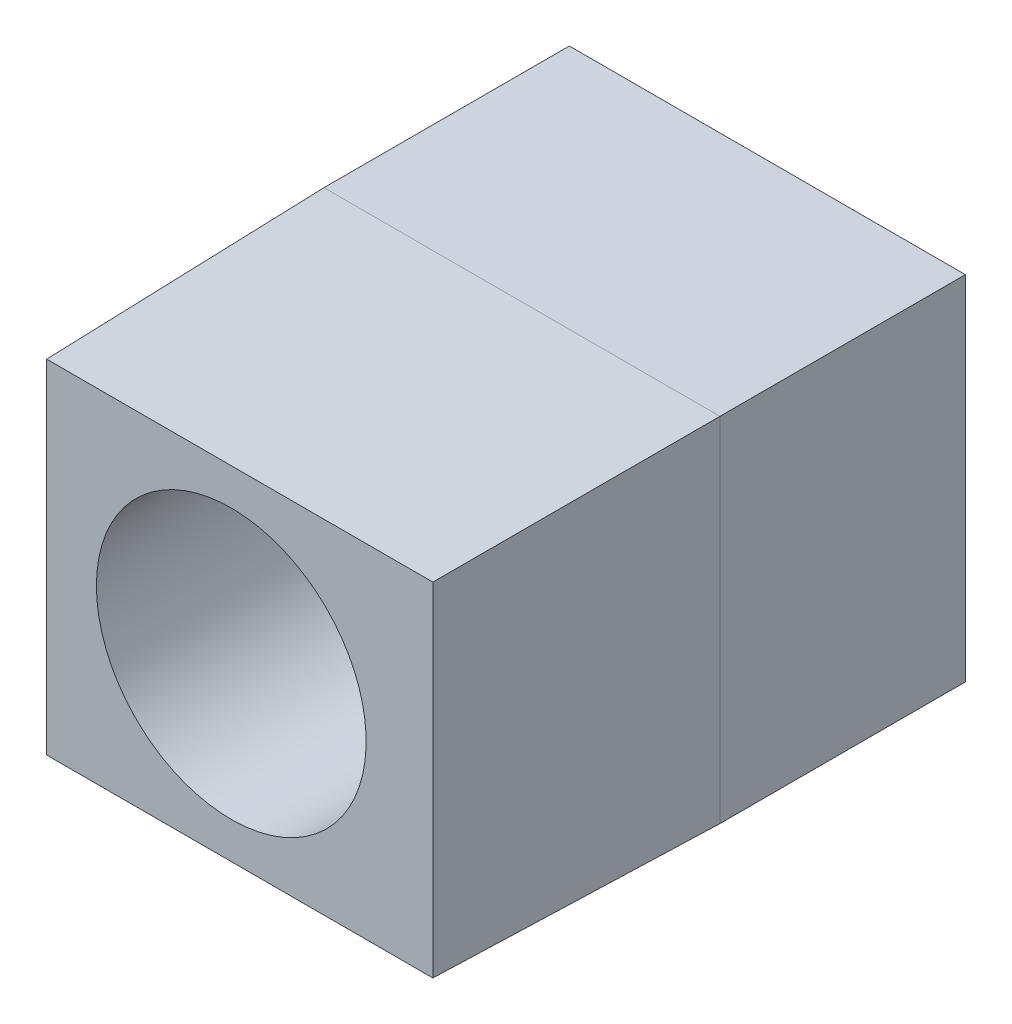
ISO-10303-21;
HEADER;
FILE_DESCRIPTION(('STEP AP214'),'2;1');
FILE_NAME('part.step','',(''),(''),'','','');
FILE_SCHEMA(('AUTOMOTIVE_DESIGN { 1 0 10303 214 1 1 1 1 }'));
ENDSEC;
DATA;
#1=APPLICATION_CONTEXT('core data for automotive mechanical design processes');
#2=APPLICATION_PROTOCOL_DEFINITION('international standard','automotive_design',2000,#1);
#3=PRODUCT_CONTEXT('',#1,'mechanical');
#4=PRODUCT('Part','Part','',(#3));
#5=PRODUCT_RELATED_PRODUCT_CATEGORY('part','',(#4));
#6=PRODUCT_DEFINITION_FORMATION('','',#4);
#7=PRODUCT_DEFINITION_CONTEXT('part definition',#1,'design');
#8=PRODUCT_DEFINITION('design','',#6,#7);
#9=PRODUCT_DEFINITION_SHAPE('','',#8);
#10=(LENGTH_UNIT() NAMED_UNIT(*) SI_UNIT(.MILLI.,.METRE.));
#11=(NAMED_UNIT(*) PLANE_ANGLE_UNIT() SI_UNIT($,.RADIAN.));
#12=(NAMED_UNIT(*) SI_UNIT($,.STERADIAN.) SOLID_ANGLE_UNIT());
#13=UNCERTAINTY_MEASURE_WITH_UNIT(LENGTH_MEASURE(1.E-05),#10,'distance_accuracy_value','');
#14=(GEOMETRIC_REPRESENTATION_CONTEXT(3) GLOBAL_UNCERTAINTY_ASSIGNED_CONTEXT((#13)) GLOBAL_UNIT_ASSIGNED_CONTEXT((#10,
#11,#12)) REPRESENTATION_CONTEXT('',''));
#15=CARTESIAN_POINT('',(0.,0.,0.));
#16=DIRECTION('',(0.,0.,1.));
#17=DIRECTION('',(1.,0.,0.));
#18=AXIS2_PLACEMENT_3D('',#15,#16,#17);
#19=CARTESIAN_POINT('',(291.048714143512,-259.226829150898,-360.68));
#20=DIRECTION('',(1.,0.,0.));
#21=DIRECTION('',(0.,0.,-1.));
#22=AXIS2_PLACEMENT_3D('',#19,#20,#21);
#23=PLANE('',#22);
#24=DIRECTION('',(0.,1.,0.));
#25=VECTOR('',#24,1.);
#26=CARTESIAN_POINT('',(291.048714143512,-259.226829150898,0.));
#27=LINE('',#26,#25);
#28=CARTESIAN_POINT('',(291.048714143512,-259.226829150898,0.));
#29=VERTEX_POINT('',#28);
#30=CARTESIAN_POINT('',(291.048714143512,259.226829150898,0.));
#31=VERTEX_POINT('',#30);
#32=EDGE_CURVE('E89',#29,#31,#27,.T.);
#33=ORIENTED_EDGE('',*,*,#32,.F.);
#34=DIRECTION('',(0.,0.,1.));
#35=VECTOR('',#34,1.);
#36=CARTESIAN_POINT('',(291.048714143512,-259.226829150898,-360.68));
#37=LINE('',#36,#35);
#38=CARTESIAN_POINT('',(291.048714143512,-259.226829150898,-360.68));
#39=VERTEX_POINT('',#38);
#40=EDGE_CURVE('E11',#39,#29,#37,.T.);
#41=ORIENTED_EDGE('',*,*,#40,.F.);
#42=DIRECTION('',(0.,1.,0.));
#43=VECTOR('',#42,1.);
#44=CARTESIAN_POINT('',(291.048714143512,-259.226829150898,-360.68));
#45=LINE('',#44,#43);
#46=CARTESIAN_POINT('',(291.048714143512,259.226829150898,-360.68));
#47=VERTEX_POINT('',#46);
#48=EDGE_CURVE('E113',#39,#47,#45,.T.);
#49=ORIENTED_EDGE('',*,*,#48,.T.);
#50=DIRECTION('',(0.,0.,1.));
#51=VECTOR('',#50,1.);
#52=CARTESIAN_POINT('',(291.048714143512,259.226829150898,-360.68));
#53=LINE('',#52,#51);
#54=EDGE_CURVE('E36',#47,#31,#53,.T.);
#55=ORIENTED_EDGE('',*,*,#54,.T.);
#56=EDGE_LOOP('',(#33,#41,#49,#55));
#57=FACE_BOUND('',#56,.T.);
#58=ADVANCED_FACE('F33',(#57),#23,.T.);
#59=CARTESIAN_POINT('',(-291.048714143512,-259.226829150898,-360.68));
#60=DIRECTION('',(0.,-1.,0.));
#61=DIRECTION('',(0.,0.,-1.));
#62=AXIS2_PLACEMENT_3D('',#59,#60,#61);
#63=PLANE('',#62);
#64=DIRECTION('',(1.,0.,0.));
#65=VECTOR('',#64,1.);
#66=CARTESIAN_POINT('',(-291.048714143512,-259.226829150898,0.));
#67=LINE('',#66,#65);
#68=CARTESIAN_POINT('',(-291.048714143512,-259.226829150898,0.));
#69=VERTEX_POINT('',#68);
#70=EDGE_CURVE('E100',#69,#29,#67,.T.);
#71=ORIENTED_EDGE('',*,*,#70,.F.);
#72=DIRECTION('',(0.,0.,1.));
#73=VECTOR('',#72,1.);
#74=CARTESIAN_POINT('',(-291.048714143512,-259.226829150898,-360.68));
#75=LINE('',#74,#73);
#76=CARTESIAN_POINT('',(-291.048714143512,-259.226829150898,-360.68));
#77=VERTEX_POINT('',#76);
#78=EDGE_CURVE('E42',#77,#69,#75,.T.);
#79=ORIENTED_EDGE('',*,*,#78,.F.);
#80=DIRECTION('',(1.,0.,0.));
#81=VECTOR('',#80,1.);
#82=CARTESIAN_POINT('',(-291.048714143512,-259.226829150898,-360.68));
#83=LINE('',#82,#81);
#84=EDGE_CURVE('E103',#77,#39,#83,.T.);
#85=ORIENTED_EDGE('',*,*,#84,.T.);
#86=ORIENTED_EDGE('',*,*,#40,.T.);
#87=EDGE_LOOP('',(#71,#79,#85,#86));
#88=FACE_BOUND('',#87,.T.);
#89=ADVANCED_FACE('F99',(#88),#63,.T.);
#90=CARTESIAN_POINT('',(-291.048714143512,-259.226829150898,-360.68));
#91=DIRECTION('',(-1.,0.,0.));
#92=DIRECTION('',(0.,0.,1.));
#93=AXIS2_PLACEMENT_3D('',#90,#91,#92);
#94=PLANE('',#93);
#95=DIRECTION('',(0.,-1.,0.));
#96=VECTOR('',#95,1.);
#97=CARTESIAN_POINT('',(-291.048714143512,-259.226829150898,0.));
#98=LINE('',#97,#96);
#99=CARTESIAN_POINT('',(-291.048714143512,259.226829150898,0.));
#100=VERTEX_POINT('',#99);
#101=EDGE_CURVE('E114',#100,#69,#98,.T.);
#102=ORIENTED_EDGE('',*,*,#101,.F.);
#103=DIRECTION('',(0.,0.,1.));
#104=VECTOR('',#103,1.);
#105=CARTESIAN_POINT('',(-291.048714143512,259.226829150898,-360.68));
#106=LINE('',#105,#104);
#107=CARTESIAN_POINT('',(-291.048714143512,259.226829150898,-360.68));
#108=VERTEX_POINT('',#107);
#109=EDGE_CURVE('E65',#108,#100,#106,.T.);
#110=ORIENTED_EDGE('',*,*,#109,.F.);
#111=DIRECTION('',(0.,-1.,0.));
#112=VECTOR('',#111,1.);
#113=CARTESIAN_POINT('',(-291.048714143512,-259.226829150898,-360.68));
#114=LINE('',#113,#112);
#115=EDGE_CURVE('E138',#108,#77,#114,.T.);
#116=ORIENTED_EDGE('',*,*,#115,.T.);
#117=ORIENTED_EDGE('',*,*,#78,.T.);
#118=EDGE_LOOP('',(#102,#110,#116,#117));
#119=FACE_BOUND('',#118,.T.);
#120=ADVANCED_FACE('F148',(#119),#94,.T.);
#121=CARTESIAN_POINT('',(-291.048714143512,259.226829150898,-360.68));
#122=DIRECTION('',(0.,1.,0.));
#123=DIRECTION('',(0.,0.,1.));
#124=AXIS2_PLACEMENT_3D('',#121,#122,#123);
#125=PLANE('',#124);
#126=DIRECTION('',(-1.,0.,0.));
#127=VECTOR('',#126,1.);
#128=CARTESIAN_POINT('',(-291.048714143512,259.226829150898,0.));
#129=LINE('',#128,#127);
#130=EDGE_CURVE('E93',#31,#100,#129,.T.);
#131=ORIENTED_EDGE('',*,*,#130,.F.);
#132=ORIENTED_EDGE('',*,*,#54,.F.);
#133=DIRECTION('',(-1.,0.,0.));
#134=VECTOR('',#133,1.);
#135=CARTESIAN_POINT('',(-291.048714143512,259.226829150898,-360.68));
#136=LINE('',#135,#134);
#137=EDGE_CURVE('E136',#47,#108,#136,.T.);
#138=ORIENTED_EDGE('',*,*,#137,.T.);
#139=ORIENTED_EDGE('',*,*,#109,.T.);
#140=EDGE_LOOP('',(#131,#132,#138,#139));
#141=FACE_BOUND('',#140,.T.);
#142=ADVANCED_FACE('F153',(#141),#125,.T.);
#143=CARTESIAN_POINT('',(0.,0.,-360.68));
#144=DIRECTION('',(0.,0.,-1.));
#145=DIRECTION('',(-1.,0.,0.));
#146=AXIS2_PLACEMENT_3D('',#143,#144,#145);
#147=PLANE('',#146);
#148=CARTESIAN_POINT('',(-12.4562482640584,0.,-360.68));
#149=DIRECTION('',(0.,0.,-1.));
#150=DIRECTION('',(-1.,0.,0.));
#151=AXIS2_PLACEMENT_3D('',#148,#149,#150);
#152=CIRCLE('',#151,198.240238767325);
#153=CARTESIAN_POINT('',(-210.696487031384,0.,-360.68));
#154=VERTEX_POINT('',#153);
#155=EDGE_CURVE('E193',#154,#154,#152,.T.);
#156=ORIENTED_EDGE('',*,*,#155,.F.);
#157=EDGE_LOOP('',(#156));
#158=FACE_BOUND('',#157,.T.);
#159=ORIENTED_EDGE('',*,*,#48,.F.);
#160=ORIENTED_EDGE('',*,*,#84,.F.);
#161=ORIENTED_EDGE('',*,*,#115,.F.);
#162=ORIENTED_EDGE('',*,*,#137,.F.);
#163=EDGE_LOOP('',(#159,#160,#161,#162));
#164=FACE_BOUND('',#163,.T.);
#165=ADVANCED_FACE('F155',(#158,#164),#147,.T.);
#166=CARTESIAN_POINT('',(291.048714143512,-259.226829150898,0.));
#167=DIRECTION('',(0.999847695156391,0.,0.0174524064372835));
#168=DIRECTION('',(0.0174524064372835,0.,-0.999847695156391));
#169=AXIS2_PLACEMENT_3D('',#166,#167,#168);
#170=PLANE('',#169);
#171=ORIENTED_EDGE('',*,*,#32,.T.);
#172=DIRECTION('',(0.0174497491606827,0.0174497491606827,-0.999695459881887));
#173=VECTOR('',#172,1.);
#174=CARTESIAN_POINT('',(290.871469117169,259.049584124555,10.1543607584125));
#175=LINE('',#174,#173);
#176=CARTESIAN_POINT('',(283.808667402456,251.986782409842,414.782));
#177=VERTEX_POINT('',#176);
#178=EDGE_CURVE('E94',#177,#31,#175,.T.);
#179=ORIENTED_EDGE('',*,*,#178,.F.);
#180=DIRECTION('',(0.,-1.,0.));
#181=VECTOR('',#180,1.);
#182=CARTESIAN_POINT('',(283.808667402456,0.,414.782));
#183=LINE('',#182,#181);
#184=CARTESIAN_POINT('',(283.808667402456,-251.986782409842,414.782));
#185=VERTEX_POINT('',#184);
#186=EDGE_CURVE('E118',#185,#177,#183,.F.);
#187=ORIENTED_EDGE('',*,*,#186,.F.);
#188=DIRECTION('',(0.0174497491606827,-0.0174497491606827,-0.999695459881887));
#189=VECTOR('',#188,1.);
#190=CARTESIAN_POINT('',(291.048714143512,-259.226829150898,0.));
#191=LINE('',#190,#189);
#192=EDGE_CURVE('E109',#185,#29,#191,.T.);
#193=ORIENTED_EDGE('',*,*,#192,.T.);
#194=EDGE_LOOP('',(#171,#179,#187,#193));
#195=FACE_BOUND('',#194,.T.);
#196=ADVANCED_FACE('F116',(#195),#170,.T.);
#197=CARTESIAN_POINT('',(-291.048714143512,259.226829150898,0.));
#198=DIRECTION('',(0.,0.999847695156391,0.0174524064372835));
#199=DIRECTION('',(0.,-0.0174524064372835,0.999847695156391));
#200=AXIS2_PLACEMENT_3D('',#197,#198,#199);
#201=PLANE('',#200);
#202=ORIENTED_EDGE('',*,*,#130,.T.);
#203=DIRECTION('',(-0.0174497491606827,0.0174497491606827,-0.999695459881887));
#204=VECTOR('',#203,1.);
#205=CARTESIAN_POINT('',(-290.890848247087,259.068963254473,9.0441311489857));
#206=LINE('',#205,#204);
#207=CARTESIAN_POINT('',(-283.808667402456,251.986782409842,414.782));
#208=VERTEX_POINT('',#207);
#209=EDGE_CURVE('E121',#208,#100,#206,.T.);
#210=ORIENTED_EDGE('',*,*,#209,.F.);
#211=DIRECTION('',(1.,0.,0.));
#212=VECTOR('',#211,1.);
#213=CARTESIAN_POINT('',(0.,251.986782409842,414.782));
#214=LINE('',#213,#212);
#215=EDGE_CURVE('E131',#177,#208,#214,.F.);
#216=ORIENTED_EDGE('',*,*,#215,.F.);
#217=ORIENTED_EDGE('',*,*,#178,.T.);
#218=EDGE_LOOP('',(#202,#210,#216,#217));
#219=FACE_BOUND('',#218,.T.);
#220=ADVANCED_FACE('F152',(#219),#201,.T.);
#221=CARTESIAN_POINT('',(-291.048714143512,-259.226829150898,0.));
#222=DIRECTION('',(-0.999847695156391,0.,0.0174524064372835));
#223=DIRECTION('',(0.0174524064372835,0.,0.999847695156391));
#224=AXIS2_PLACEMENT_3D('',#221,#222,#223);
#225=PLANE('',#224);
#226=ORIENTED_EDGE('',*,*,#101,.T.);
#227=DIRECTION('',(-0.0174497491606827,-0.0174497491606827,-0.999695459881887));
#228=VECTOR('',#227,1.);
#229=CARTESIAN_POINT('',(-291.048714143512,-259.226829150898,0.));
#230=LINE('',#229,#228);
#231=CARTESIAN_POINT('',(-283.808667402456,-251.986782409842,414.782));
#232=VERTEX_POINT('',#231);
#233=EDGE_CURVE('E112',#232,#69,#230,.T.);
#234=ORIENTED_EDGE('',*,*,#233,.F.);
#235=DIRECTION('',(0.,1.,0.));
#236=VECTOR('',#235,1.);
#237=CARTESIAN_POINT('',(-283.808667402456,0.,414.782));
#238=LINE('',#237,#236);
#239=EDGE_CURVE('E123',#208,#232,#238,.F.);
#240=ORIENTED_EDGE('',*,*,#239,.F.);
#241=ORIENTED_EDGE('',*,*,#209,.T.);
#242=EDGE_LOOP('',(#226,#234,#240,#241));
#243=FACE_BOUND('',#242,.T.);
#244=ADVANCED_FACE('F145',(#243),#225,.T.);
#245=CARTESIAN_POINT('',(-291.048714143512,-259.226829150898,0.));
#246=DIRECTION('',(0.,-0.999847695156391,0.0174524064372835));
#247=DIRECTION('',(0.,-0.0174524064372835,-0.999847695156391));
#248=AXIS2_PLACEMENT_3D('',#245,#246,#247);
#249=PLANE('',#248);
#250=ORIENTED_EDGE('',*,*,#70,.T.);
#251=ORIENTED_EDGE('',*,*,#192,.F.);
#252=DIRECTION('',(-1.,0.,0.));
#253=VECTOR('',#252,1.);
#254=CARTESIAN_POINT('',(0.,-251.986782409842,414.782));
#255=LINE('',#254,#253);
#256=EDGE_CURVE('E119',#232,#185,#255,.F.);
#257=ORIENTED_EDGE('',*,*,#256,.F.);
#258=ORIENTED_EDGE('',*,*,#233,.T.);
#259=EDGE_LOOP('',(#250,#251,#257,#258));
#260=FACE_BOUND('',#259,.T.);
#261=ADVANCED_FACE('F107',(#260),#249,.T.);
#262=CARTESIAN_POINT('',(0.,0.,414.782));
#263=DIRECTION('',(0.,0.,-1.));
#264=DIRECTION('',(-1.,0.,0.));
#265=AXIS2_PLACEMENT_3D('',#262,#263,#264);
#266=PLANE('',#265);
#267=CARTESIAN_POINT('',(-12.4562482640584,0.,414.782));
#268=DIRECTION('',(0.,0.,-1.));
#269=DIRECTION('',(-1.,0.,0.));
#270=AXIS2_PLACEMENT_3D('',#267,#268,#269);
#271=CIRCLE('',#270,198.240238767325);
#272=CARTESIAN_POINT('',(-210.696487031384,0.,414.782));
#273=VERTEX_POINT('',#272);
#274=EDGE_CURVE('E132',#273,#273,#271,.T.);
#275=ORIENTED_EDGE('',*,*,#274,.T.);
#276=EDGE_LOOP('',(#275));
#277=FACE_BOUND('',#276,.T.);
#278=ORIENTED_EDGE('',*,*,#186,.T.);
#279=ORIENTED_EDGE('',*,*,#215,.T.);
#280=ORIENTED_EDGE('',*,*,#239,.T.);
#281=ORIENTED_EDGE('',*,*,#256,.T.);
#282=EDGE_LOOP('',(#278,#279,#280,#281));
#283=FACE_BOUND('',#282,.T.);
#284=ADVANCED_FACE('F177',(#277,#283),#266,.F.);
#285=CARTESIAN_POINT('',(-12.4562482640584,0.,414.782));
#286=DIRECTION('',(0.,0.,-1.));
#287=DIRECTION('',(-1.,0.,0.));
#288=AXIS2_PLACEMENT_3D('',#285,#286,#287);
#289=CYLINDRICAL_SURFACE('',#288,198.240238767325);
#290=ORIENTED_EDGE('',*,*,#274,.F.);
#291=EDGE_LOOP('',(#290));
#292=FACE_BOUND('',#291,.T.);
#293=ORIENTED_EDGE('',*,*,#155,.T.);
#294=EDGE_LOOP('',(#293));
#295=FACE_BOUND('',#294,.T.);
#296=ADVANCED_FACE('F182',(#292,#295),#289,.F.);
#297=CLOSED_SHELL('',(#58,#89,#120,#142,#165,#196,#220,#244,#261,#284,#296));
#298=MANIFOLD_SOLID_BREP('B2',#297);
#299=ADVANCED_BREP_SHAPE_REPRESENTATION('',(#18,#298),#14);
#300=SHAPE_DEFINITION_REPRESENTATION(#9,#299);
ENDSEC;
END-ISO-10303-21;
